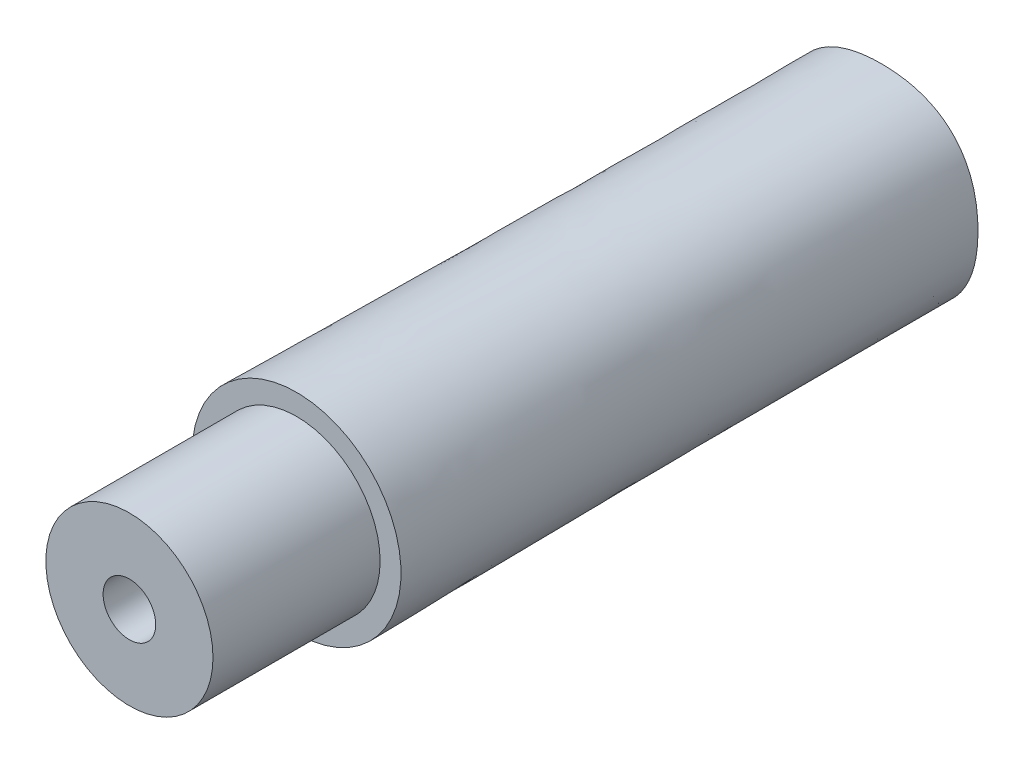
ISO-10303-21;
HEADER;
FILE_DESCRIPTION(('STEP AP214'),'2;1');
FILE_NAME('part.step','',(''),(''),'','','');
FILE_SCHEMA(('AUTOMOTIVE_DESIGN { 1 0 10303 214 1 1 1 1 }'));
ENDSEC;
DATA;
#1=APPLICATION_CONTEXT('core data for automotive mechanical design processes');
#2=APPLICATION_PROTOCOL_DEFINITION('international standard','automotive_design',2000,#1);
#3=PRODUCT_CONTEXT('',#1,'mechanical');
#4=PRODUCT('Part','Part','',(#3));
#5=PRODUCT_RELATED_PRODUCT_CATEGORY('part','',(#4));
#6=PRODUCT_DEFINITION_FORMATION('','',#4);
#7=PRODUCT_DEFINITION_CONTEXT('part definition',#1,'design');
#8=PRODUCT_DEFINITION('design','',#6,#7);
#9=PRODUCT_DEFINITION_SHAPE('','',#8);
#10=(LENGTH_UNIT() NAMED_UNIT(*) SI_UNIT(.MILLI.,.METRE.));
#11=(NAMED_UNIT(*) PLANE_ANGLE_UNIT() SI_UNIT($,.RADIAN.));
#12=(NAMED_UNIT(*) SI_UNIT($,.STERADIAN.) SOLID_ANGLE_UNIT());
#13=UNCERTAINTY_MEASURE_WITH_UNIT(LENGTH_MEASURE(1.E-05),#10,'distance_accuracy_value','');
#14=(GEOMETRIC_REPRESENTATION_CONTEXT(3) GLOBAL_UNCERTAINTY_ASSIGNED_CONTEXT((#13)) GLOBAL_UNIT_ASSIGNED_CONTEXT((#10,
#11,#12)) REPRESENTATION_CONTEXT('',''));
#15=CARTESIAN_POINT('',(0.,0.,0.));
#16=DIRECTION('',(0.,0.,1.));
#17=DIRECTION('',(1.,0.,0.));
#18=AXIS2_PLACEMENT_3D('',#15,#16,#17);
#19=CARTESIAN_POINT('',(-15.,0.,0.));
#20=CARTESIAN_POINT('',(-11.4703442530879,0.,73.4161185565387));
#21=CARTESIAN_POINT('',(-10.63958843352,0.,146.522630678536));
#22=CARTESIAN_POINT('',(-12.5,0.,220.));
#23=CARTESIAN_POINT('',(-15.,-1.96349539571791,0.));
#24=CARTESIAN_POINT('',(-11.4703442530879,-1.85441231817803,73.4161185565387));
#25=CARTESIAN_POINT('',(-10.63958843352,-1.74532924063814,146.522630678536));
#26=CARTESIAN_POINT('',(-12.5,-1.63624616309826,220.));
#27=CARTESIAN_POINT('',(-14.2198461388777,-5.88984756492641,0.));
#28=CARTESIAN_POINT('',(-11.0705725748364,-5.22559350962199,73.4161185565386));
#29=CARTESIAN_POINT('',(-10.2828364472213,-4.89870194523564,146.522630678536));
#30=CARTESIAN_POINT('',(-11.8498717823981,-4.90820630410533,220.));
#31=CARTESIAN_POINT('',(-10.882974650403,-10.8829746504029,0.));
#32=CARTESIAN_POINT('',(-8.93020374081342,-8.93020374081315,73.4161185565387));
#33=CARTESIAN_POINT('',(-8.32688279489595,-8.3268827948957,146.522630678537));
#34=CARTESIAN_POINT('',(-9.06914554200247,-9.06914554200244,220.000000000001));
#35=CARTESIAN_POINT('',(-5.88984756492637,-14.2198461388777,0.));
#36=CARTESIAN_POINT('',(-5.225593509622,-11.0705725748361,73.4161185565382));
#37=CARTESIAN_POINT('',(-4.89870194523566,-10.2828364472209,146.522630678536));
#38=CARTESIAN_POINT('',(-4.90820630410531,-11.8498717823981,220.));
#39=CARTESIAN_POINT('',(-1.96349539571792,-15.,0.));
#40=CARTESIAN_POINT('',(-1.85441231817803,-11.4703442530875,73.4161185565383));
#41=CARTESIAN_POINT('',(-1.74532924063814,-10.6395884335195,146.522630678536));
#42=CARTESIAN_POINT('',(-1.63624616309826,-12.5,220.));
#43=CARTESIAN_POINT('',(1.96349539571791,-15.,0.));
#44=CARTESIAN_POINT('',(1.85441231817803,-11.4703442530875,73.4161185565383));
#45=CARTESIAN_POINT('',(1.74532924063814,-10.6395884335195,146.522630678536));
#46=CARTESIAN_POINT('',(1.63624616309826,-12.5,220.));
#47=CARTESIAN_POINT('',(5.88984756492637,-14.2198461388777,0.));
#48=CARTESIAN_POINT('',(5.22559350962201,-11.0705725748361,73.4161185565382));
#49=CARTESIAN_POINT('',(4.89870194523567,-10.2828364472209,146.522630678536));
#50=CARTESIAN_POINT('',(4.90820630410531,-11.8498717823981,220.));
#51=CARTESIAN_POINT('',(10.8829746504029,-10.8829746504029,0.));
#52=CARTESIAN_POINT('',(8.9302037408134,-8.93020374081318,73.4161185565382));
#53=CARTESIAN_POINT('',(8.32688279489594,-8.32688279489572,146.522630678536));
#54=CARTESIAN_POINT('',(9.06914554200246,-9.06914554200246,220.));
#55=CARTESIAN_POINT('',(14.2198461388777,-5.8898475649264,0.));
#56=CARTESIAN_POINT('',(11.0705725748364,-5.22559350962197,73.4161185565379));
#57=CARTESIAN_POINT('',(10.2828364472213,-4.89870194523562,146.522630678536));
#58=CARTESIAN_POINT('',(11.8498717823981,-4.90820630410532,220.));
#59=CARTESIAN_POINT('',(15.,-1.96349539571791,0.));
#60=CARTESIAN_POINT('',(11.4703442530879,-1.85441231817803,73.4161185565379));
#61=CARTESIAN_POINT('',(10.63958843352,-1.74532924063814,146.522630678536));
#62=CARTESIAN_POINT('',(12.5,-1.63624616309826,220.));
#63=CARTESIAN_POINT('',(15.,1.96349539571791,0.));
#64=CARTESIAN_POINT('',(11.4703442530879,1.85441231817803,73.4161185565379));
#65=CARTESIAN_POINT('',(10.63958843352,1.74532924063814,146.522630678536));
#66=CARTESIAN_POINT('',(12.5,1.63624616309826,220.));
#67=CARTESIAN_POINT('',(14.2198461388777,5.8898475649264,0.));
#68=CARTESIAN_POINT('',(11.0705725748364,5.22559350962203,73.4161185565376));
#69=CARTESIAN_POINT('',(10.2828364472213,4.89870194523567,146.522630678535));
#70=CARTESIAN_POINT('',(11.8498717823981,4.90820630410532,219.999999999999));
#71=CARTESIAN_POINT('',(10.8829746504029,10.8829746504029,0.));
#72=CARTESIAN_POINT('',(8.9302037408134,8.93020374081338,73.4161185565383));
#73=CARTESIAN_POINT('',(8.32688279489595,8.32688279489593,146.522630678537));
#74=CARTESIAN_POINT('',(9.06914554200247,9.06914554200246,220.000000000001));
#75=CARTESIAN_POINT('',(5.88984756492638,14.2198461388777,0.));
#76=CARTESIAN_POINT('',(5.22559350962201,11.0705725748364,73.4161185565376));
#77=CARTESIAN_POINT('',(4.89870194523566,10.2828364472213,146.522630678535));
#78=CARTESIAN_POINT('',(4.90820630410531,11.8498717823981,219.999999999999));
#79=CARTESIAN_POINT('',(1.96349539571791,15.,0.));
#80=CARTESIAN_POINT('',(1.85441231817802,11.4703442530879,73.4161185565379));
#81=CARTESIAN_POINT('',(1.74532924063814,10.63958843352,146.522630678536));
#82=CARTESIAN_POINT('',(1.63624616309826,12.5,220.));
#83=CARTESIAN_POINT('',(-1.96349539571791,15.,0.));
#84=CARTESIAN_POINT('',(-1.85441231817803,11.4703442530879,73.4161185565379));
#85=CARTESIAN_POINT('',(-1.74532924063815,10.63958843352,146.522630678536));
#86=CARTESIAN_POINT('',(-1.63624616309826,12.5,220.));
#87=CARTESIAN_POINT('',(-5.88984756492638,14.2198461388777,0.));
#88=CARTESIAN_POINT('',(-5.22559350962202,11.0705725748364,73.4161185565378));
#89=CARTESIAN_POINT('',(-4.89870194523568,10.2828364472213,146.522630678536));
#90=CARTESIAN_POINT('',(-4.90820630410532,11.8498717823981,219.999999999999));
#91=CARTESIAN_POINT('',(-10.882974650403,10.882974650403,0.));
#92=CARTESIAN_POINT('',(-8.93020374081341,8.93020374081341,73.4161185565386));
#93=CARTESIAN_POINT('',(-8.32688279489594,8.32688279489595,146.522630678537));
#94=CARTESIAN_POINT('',(-9.06914554200245,9.06914554200247,220.000000000001));
#95=CARTESIAN_POINT('',(-14.2198461388777,5.88984756492638,0.));
#96=CARTESIAN_POINT('',(-11.0705725748364,5.22559350962201,73.4161185565384));
#97=CARTESIAN_POINT('',(-10.2828364472213,4.89870194523566,146.522630678536));
#98=CARTESIAN_POINT('',(-11.8498717823981,4.90820630410531,219.999999999999));
#99=CARTESIAN_POINT('',(-15.,1.96349539571791,0.));
#100=CARTESIAN_POINT('',(-11.4703442530879,1.85441231817803,73.4161185565387));
#101=CARTESIAN_POINT('',(-10.63958843352,1.74532924063814,146.522630678536));
#102=CARTESIAN_POINT('',(-12.5,1.63624616309826,220.));
#103=CARTESIAN_POINT('',(-15.,0.,0.));
#104=CARTESIAN_POINT('',(-11.4703442530879,0.,73.4161185565387));
#105=CARTESIAN_POINT('',(-10.63958843352,0.,146.522630678536));
#106=CARTESIAN_POINT('',(-12.5,0.,220.));
#107=B_SPLINE_SURFACE_WITH_KNOTS('',3,3,((#19,#20,#21,#22),(#23,#24,#25,#26),(#27,#28,#29,#30),
(#31,#32,#33,#34),(#35,#36,#37,#38),(#39,#40,#41,#42),(#43,#44,#45,#46),(#47,#48,#49,#50),(#51,
#52,#53,#54),(#55,#56,#57,#58),(#59,#60,#61,#62),(#63,#64,#65,#66),(#67,#68,#69,#70),(#71,#72,
#73,#74),(#75,#76,#77,#78),(#79,#80,#81,#82),(#83,#84,#85,#86),(#87,#88,#89,#90),(#91,#92,#93,
#94),(#95,#96,#97,#98),(#99,#100,#101,#102),(#103,#104,#105,#106)),.UNSPECIFIED.,.T.,.F.,.F.,(4,
1,1,1,2,1,1,1,2,1,1,1,2,1,1,1,4),(4,4),(0.,0.0625,0.125,0.1875,0.25,0.3125,0.375,0.4375,0.5,
0.5625,0.625,0.6875,0.75,0.8125,0.875,0.9375,1.),(0.,1.),.UNSPECIFIED.);
#108=CARTESIAN_POINT('',(0.,0.,220.));
#109=DIRECTION('',(0.,0.,1.));
#110=DIRECTION('',(1.,0.,0.));
#111=AXIS2_PLACEMENT_3D('',#108,#109,#110);
#112=CIRCLE('',#111,12.5);
#113=CARTESIAN_POINT('',(-12.5,0.,220.));
#114=VERTEX_POINT('',#113);
#115=EDGE_CURVE('E133',#114,#114,#112,.T.);
#116=CARTESIAN_POINT('',(-11.541854565399,0.,149.999999997366));
#117=CARTESIAN_POINT('',(-11.5418536994029,-0.401355757927279,149.999999997418));
#118=CARTESIAN_POINT('',(-11.5293171598583,-0.802707549844226,149.999999999308));
#119=CARTESIAN_POINT('',(-11.4759797494714,-1.60374827617522,150.000000000692));
#120=CARTESIAN_POINT('',(-11.4351710584041,-2.00343671971828,150.000000000185));
#121=CARTESIAN_POINT('',(-11.3216394636897,-2.79775464109179,149.999999999815));
#122=CARTESIAN_POINT('',(-11.2489631262335,-3.19239063899266,149.999999999951));
#123=CARTESIAN_POINT('',(-11.0675723921283,-3.97326288959729,150.000000000049));
#124=CARTESIAN_POINT('',(-10.9588815423036,-4.3595044553448,150.000000000011));
#125=CARTESIAN_POINT('',(-10.7427202803528,-4.9960152801339,149.999999999993));
#126=CARTESIAN_POINT('',(-10.6461388384174,-5.25000013290062,149.999999999998));
#127=CARTESIAN_POINT('',(-10.4337811359734,-5.74984283685569,150.000000000002));
#128=CARTESIAN_POINT('',(-10.3180063908867,-5.99570132783038,150.000000000001));
#129=CARTESIAN_POINT('',(-10.0670053989865,-6.47705937535507,149.999999999999));
#130=CARTESIAN_POINT('',(-9.93179509497459,-6.7125672176856,150.));
#131=CARTESIAN_POINT('',(-9.64184809256927,-7.17122321615265,150.));
#132=CARTESIAN_POINT('',(-9.48711373000722,-7.39437284622081,150.));
#133=CARTESIAN_POINT('',(-9.15750136454443,-7.82742626969343,150.));
#134=CARTESIAN_POINT('',(-8.98251048976429,-8.03724465529183,150.));
#135=CARTESIAN_POINT('',(-8.70624921174298,-8.33924259631013,150.));
#136=CARTESIAN_POINT('',(-8.61186139999785,-8.43779142263712,150.));
#137=CARTESIAN_POINT('',(-8.41861810790369,-8.63045563928594,150.));
#138=CARTESIAN_POINT('',(-8.31976153520119,-8.72456993401321,150.));
#139=CARTESIAN_POINT('',(-8.01694953836434,-8.99991540051646,150.));
#140=CARTESIAN_POINT('',(-7.80665548691768,-9.17425435822067,150.));
#141=CARTESIAN_POINT('',(-7.37135617607085,-9.50359091828676,150.));
#142=CARTESIAN_POINT('',(-7.14634422384303,-9.65857962680361,150.));
#143=CARTESIAN_POINT('',(-6.69943566151898,-9.93904040360528,150.));
#144=CARTESIAN_POINT('',(-6.47834083793555,-10.0657944834204,150.));
#145=CARTESIAN_POINT('',(-6.02714425227574,-10.3021158197794,150.));
#146=CARTESIAN_POINT('',(-5.79704152776197,-10.4116812335259,150.));
#147=CARTESIAN_POINT('',(-5.32949709872402,-10.6139244558501,150.));
#148=CARTESIAN_POINT('',(-5.09205384947439,-10.706598681194,150.));
#149=CARTESIAN_POINT('',(-4.61139683146734,-10.8755182315322,150.));
#150=CARTESIAN_POINT('',(-4.36818243831409,-10.9517617697655,150.));
#151=CARTESIAN_POINT('',(-3.85608072140049,-11.0948547700045,150.));
#152=CARTESIAN_POINT('',(-3.58680439864019,-11.1603048950958,150.));
#153=CARTESIAN_POINT('',(-3.04460955998237,-11.2744817469932,150.));
#154=CARTESIAN_POINT('',(-2.7716890747401,-11.3231990169402,150.));
#155=CARTESIAN_POINT('',(-2.22348281409539,-11.4052379600946,150.));
#156=CARTESIAN_POINT('',(-1.94819632371092,-11.438554799978,150.));
#157=CARTESIAN_POINT('',(-1.39522105679997,-11.4911397562973,150.));
#158=CARTESIAN_POINT('',(-1.11752709620361,-11.5103524478534,150.));
#159=CARTESIAN_POINT('',(-0.561639275551755,-11.5356687296765,150.));
#160=CARTESIAN_POINT('',(-0.283445582040061,-11.5417760846317,150.));
#161=CARTESIAN_POINT('',(0.27291832299971,-11.5419316056286,150.));
#162=CARTESIAN_POINT('',(0.551088535015663,-11.5359802173951,150.));
#163=CARTESIAN_POINT('',(1.19691351920611,-11.5069535016099,150.));
#164=CARTESIAN_POINT('',(1.5643781536077,-11.4789574123874,150.));
#165=CARTESIAN_POINT('',(2.11335862067173,-11.4177369408435,150.));
#166=CARTESIAN_POINT('',(2.29597764410096,-11.3941266519661,150.));
#167=CARTESIAN_POINT('',(2.66026578396025,-11.3401093531148,150.));
#168=CARTESIAN_POINT('',(2.84193454474969,-11.3096999621338,150.));
#169=CARTESIAN_POINT('',(3.38325932982941,-11.2079976696009,150.));
#170=CARTESIAN_POINT('',(3.74103471936672,-11.126038003588,150.));
#171=CARTESIAN_POINT('',(4.27101276853864,-10.9793388933274,150.));
#172=CARTESIAN_POINT('',(4.44656941455521,-10.9264749427759,150.));
#173=CARTESIAN_POINT('',(4.79494128732353,-10.8123963566293,150.));
#174=CARTESIAN_POINT('',(4.96775680415604,-10.7511826113244,150.));
#175=CARTESIAN_POINT('',(5.38993427533975,-10.5895650277931,150.));
#176=CARTESIAN_POINT('',(5.6374193009443,-10.4841956906733,150.));
#177=CARTESIAN_POINT('',(6.12341250542991,-10.2544514992782,150.));
#178=CARTESIAN_POINT('',(6.36192097243637,-10.1300772556629,150.));
#179=CARTESIAN_POINT('',(6.82800416506739,-9.86205990721202,150.));
#180=CARTESIAN_POINT('',(7.05557508095503,-9.71841015350808,150.));
#181=CARTESIAN_POINT('',(7.4974461259936,-9.4121108784702,150.));
#182=CARTESIAN_POINT('',(7.71175147278949,-9.24946890079687,150.));
#183=CARTESIAN_POINT('',(8.12599163537684,-8.90497731547193,150.));
#184=CARTESIAN_POINT('',(8.3258575398975,-8.72304467129187,150.));
#185=CARTESIAN_POINT('',(8.70814352515308,-8.34169043576707,150.));
#186=CARTESIAN_POINT('',(8.8905635988201,-8.14226883733702,150.));
#187=CARTESIAN_POINT('',(9.23674385474077,-7.72802588603659,150.));
#188=CARTESIAN_POINT('',(9.40051264724978,-7.51321171428797,150.));
#189=CARTESIAN_POINT('',(9.70893085192531,-7.07015279729179,150.));
#190=CARTESIAN_POINT('',(9.85357159024528,-6.84190202639231,150.));
#191=CARTESIAN_POINT('',(10.1164781421454,-6.38634269968815,150.));
#192=CARTESIAN_POINT('',(10.2357208863338,-6.15959543283219,150.));
#193=CARTESIAN_POINT('',(10.4569568876952,-5.69783055025263,150.));
#194=CARTESIAN_POINT('',(10.5589483802222,-5.46281209142829,150.));
#195=CARTESIAN_POINT('',(10.746093058012,-4.98598753217331,150.));
#196=CARTESIAN_POINT('',(10.8312335848246,-4.74417648368212,150.));
#197=CARTESIAN_POINT('',(10.9853598858867,-4.25547375680911,150.));
#198=CARTESIAN_POINT('',(11.0543442917362,-4.00858164999423,150.));
#199=CARTESIAN_POINT('',(11.1855243746252,-3.47793919286741,150.));
#200=CARTESIAN_POINT('',(11.2455882293671,-3.19366391267622,150.));
#201=CARTESIAN_POINT('',(11.3480841507545,-2.62182048256758,150.));
#202=CARTESIAN_POINT('',(11.3905054022288,-2.3342504235514,150.));
#203=CARTESIAN_POINT('',(11.4592057307189,-1.75706364773313,150.));
#204=CARTESIAN_POINT('',(11.4854770915521,-1.46744601937061,150.));
#205=CARTESIAN_POINT('',(11.5138155244204,-1.03189790564804,150.));
#206=CARTESIAN_POINT('',(11.5214200732818,-0.886300436970029,150.));
#207=CARTESIAN_POINT('',(11.533061955762,-0.594958534543804,150.));
#208=CARTESIAN_POINT('',(11.5370992532269,-0.449214099321083,150.));
#209=CARTESIAN_POINT('',(11.5417747295487,-0.157730273853745,150.));
#210=CARTESIAN_POINT('',(11.5424142602128,-0.0119909046745823,150.));
#211=CARTESIAN_POINT('',(11.5403610855083,0.279460748718199,150.));
#212=CARTESIAN_POINT('',(11.5376684101048,0.425173033163593,150.));
#213=CARTESIAN_POINT('',(11.5243364586219,0.862094505077408,150.));
#214=CARTESIAN_POINT('',(11.5084445767624,1.15316341010471,150.));
#215=CARTESIAN_POINT('',(11.4571778167239,1.78609261947361,150.));
#216=CARTESIAN_POINT('',(11.4188251726858,2.12772037606876,150.));
#217=CARTESIAN_POINT('',(11.3185176534011,2.80751977078997,150.));
#218=CARTESIAN_POINT('',(11.2565641974387,3.14569161548904,150.));
#219=CARTESIAN_POINT('',(11.1067334330443,3.81490275391266,150.));
#220=CARTESIAN_POINT('',(11.0189655890046,4.14596595631763,150.));
#221=CARTESIAN_POINT('',(10.8658383274791,4.63574459366194,150.));
#222=CARTESIAN_POINT('',(10.8112199494759,4.79786011791878,150.));
#223=CARTESIAN_POINT('',(10.6945243358615,5.11941766533972,150.));
#224=CARTESIAN_POINT('',(10.6324459631435,5.27885927669496,150.));
#225=CARTESIAN_POINT('',(10.4639957180397,5.68253189543206,150.));
#226=CARTESIAN_POINT('',(10.3522096413007,5.92453324930647,150.));
#227=CARTESIAN_POINT('',(10.1098492399233,6.39894785918335,150.));
#228=CARTESIAN_POINT('',(9.97927532680361,6.63136132505039,150.));
#229=CARTESIAN_POINT('',(9.69919397361224,7.08469894019758,150.));
#230=CARTESIAN_POINT('',(9.54967556483482,7.30561632796521,150.));
#231=CARTESIAN_POINT('',(9.23212465099859,7.73363753372576,150.));
#232=CARTESIAN_POINT('',(9.06410076682816,7.94074771230781,150.));
#233=CARTESIAN_POINT('',(8.79848324532445,8.23989583016644,150.));
#234=CARTESIAN_POINT('',(8.70749661383106,8.33786554693269,150.));
#235=CARTESIAN_POINT('',(8.52119653991513,8.52959727617441,150.));
#236=CARTESIAN_POINT('',(8.42588318165068,8.62335937042083,150.));
#237=CARTESIAN_POINT('',(8.13375639123133,8.89806006473028,150.));
#238=CARTESIAN_POINT('',(7.9307188639717,9.07245516430253,150.));
#239=CARTESIAN_POINT('',(7.51031133305755,9.40264067152794,150.));
#240=CARTESIAN_POINT('',(7.292949803326,9.55844192842484,150.));
#241=CARTESIAN_POINT('',(6.84576339722231,9.85119968558504,150.));
#242=CARTESIAN_POINT('',(6.61593299105821,9.9881477278517,150.));
#243=CARTESIAN_POINT('',(6.15446671413528,10.2384694135765,150.));
#244=CARTESIAN_POINT('',(5.92319300005266,10.3525137270258,150.));
#245=CARTESIAN_POINT('',(5.45286012144287,10.563241642327,150.));
#246=CARTESIAN_POINT('',(5.21380012245186,10.6599233761337,150.));
#247=CARTESIAN_POINT('',(4.72925488053419,10.8364474130886,150.));
#248=CARTESIAN_POINT('',(4.48376246498554,10.9162699331389,150.));
#249=CARTESIAN_POINT('',(3.98817276363169,11.0599596309804,150.));
#250=CARTESIAN_POINT('',(3.73807517312787,11.1238257489234,150.));
#251=CARTESIAN_POINT('',(3.19309934271747,11.2460741856969,150.));
#252=CARTESIAN_POINT('',(2.89763140502402,11.3018198231188,150.));
#253=CARTESIAN_POINT('',(2.30368190943547,11.3950220202179,150.));
#254=CARTESIAN_POINT('',(2.00519853205604,11.4324667698637,150.));
#255=CARTESIAN_POINT('',(1.40644486124677,11.4906692941387,150.));
#256=CARTESIAN_POINT('',(1.10617360920646,11.5114171143019,150.));
#257=CARTESIAN_POINT('',(0.654957775512834,11.5310954925752,150.));
#258=CARTESIAN_POINT('',(0.504235538160645,11.5357464027898,150.));
#259=CARTESIAN_POINT('',(0.202721931225564,11.5413919372327,150.));
#260=CARTESIAN_POINT('',(0.0519305609101198,11.542386521778,150.));
#261=CARTESIAN_POINT('',(-0.400265113032265,11.5400270336634,150.));
#262=CARTESIAN_POINT('',(-0.701664376340691,11.5313370056312,150.));
#263=CARTESIAN_POINT('',(-1.30352120640034,11.4983198168705,150.));
#264=CARTESIAN_POINT('',(-1.6039790396715,11.4739975783707,150.));
#265=CARTESIAN_POINT('',(-2.22952224973743,11.405325473926,150.));
#266=CARTESIAN_POINT('',(-2.5544389746431,11.3593964592959,150.));
#267=CARTESIAN_POINT('',(-3.2003394714485,11.2450875624389,150.));
#268=CARTESIAN_POINT('',(-3.52132344195218,11.1767088188102,150.));
#269=CARTESIAN_POINT('',(-4.15584527363419,11.0154934741266,150.));
#270=CARTESIAN_POINT('',(-4.46940712680948,10.9227524629793,150.));
#271=CARTESIAN_POINT('',(-5.08731021384819,10.7103625054095,150.));
#272=CARTESIAN_POINT('',(-5.39165354277786,10.5907197257317,150.));
#273=CARTESIAN_POINT('',(-5.93082254939972,10.3490505408438,150.));
#274=CARTESIAN_POINT('',(-6.16781686510172,10.2318507637158,150.));
#275=CARTESIAN_POINT('',(-6.6317239090533,9.97890651786635,150.));
#276=CARTESIAN_POINT('',(-6.85863727011576,9.84316321536554,150.));
#277=CARTESIAN_POINT('',(-7.30039432872054,9.55315824389443,150.));
#278=CARTESIAN_POINT('',(-7.51523524618186,9.39889233492606,150.));
#279=CARTESIAN_POINT('',(-7.93077346940004,9.07229199407985,150.));
#280=CARTESIAN_POINT('',(-8.13147158321449,8.89995859590081,150.));
#281=CARTESIAN_POINT('',(-8.42059370564552,8.6284543387516,150.));
#282=CARTESIAN_POINT('',(-8.51508322550793,8.53566998385946,150.));
#283=CARTESIAN_POINT('',(-8.69981989992102,8.34596960586576,150.));
#284=CARTESIAN_POINT('',(-8.79006704406861,8.24905357263366,150.));
#285=CARTESIAN_POINT('',(-9.05423047488045,7.95245722105068,150.));
#286=CARTESIAN_POINT('',(-9.22160948494089,7.74689034948627,150.));
#287=CARTESIAN_POINT('',(-9.53810831145911,7.32206689758776,150.));
#288=CARTESIAN_POINT('',(-9.6872194802265,7.10280390732519,150.));
#289=CARTESIAN_POINT('',(-9.96680435941036,6.65271636976094,150.));
#290=CARTESIAN_POINT('',(-10.0972763746923,6.42189077347518,150.));
#291=CARTESIAN_POINT('',(-10.3653895098786,5.90057358318735,150.));
#292=CARTESIAN_POINT('',(-10.4986646064036,5.60782445674551,149.999999999999));
#293=CARTESIAN_POINT('',(-10.67854786503,5.16076657034955,150.));
#294=CARTESIAN_POINT('',(-10.7351815328833,5.01038910252547,150.000000000001));
#295=CARTESIAN_POINT('',(-10.8419151693467,4.70733072067654,149.999999999999));
#296=CARTESIAN_POINT('',(-10.8920151978562,4.55464982778344,149.999999999997));
#297=CARTESIAN_POINT('',(-11.0329216672749,4.09364819502358,150.000000000006));
#298=CARTESIAN_POINT('',(-11.114315705692,3.78241578160942,150.000000000033));
#299=CARTESIAN_POINT('',(-11.2541610859927,3.15499065004393,149.999999999967));
#300=CARTESIAN_POINT('',(-11.312614514823,2.83879838582165,149.999999999873));
#301=CARTESIAN_POINT('',(-11.4237408543973,2.10429186971091,150.000000000167));
#302=CARTESIAN_POINT('',(-11.4689423855298,1.68484494882285,150.000000000713));
#303=CARTESIAN_POINT('',(-11.5280113046448,0.843598233010171,149.999999999286));
#304=CARTESIAN_POINT('',(-11.5418554755005,0.421796926366122,149.999999997311));
#305=CARTESIAN_POINT('',(-11.541854565399,0.,149.999999997366));
#306=B_SPLINE_CURVE_WITH_KNOTS('',3,(#116,#117,#118,#119,#120,#121,#122,#123,#124,#125,#126,
#127,#128,#129,#130,#131,#132,#133,#134,#135,#136,#137,#138,#139,#140,#141,#142,#143,#144,#145,
#146,#147,#148,#149,#150,#151,#152,#153,#154,#155,#156,#157,#158,#159,#160,#161,#162,#163,#164,
#165,#166,#167,#168,#169,#170,#171,#172,#173,#174,#175,#176,#177,#178,#179,#180,#181,#182,#183,
#184,#185,#186,#187,#188,#189,#190,#191,#192,#193,#194,#195,#196,#197,#198,#199,#200,#201,#202,
#203,#204,#205,#206,#207,#208,#209,#210,#211,#212,#213,#214,#215,#216,#217,#218,#219,#220,#221,
#222,#223,#224,#225,#226,#227,#228,#229,#230,#231,#232,#233,#234,#235,#236,#237,#238,#239,#240,
#241,#242,#243,#244,#245,#246,#247,#248,#249,#250,#251,#252,#253,#254,#255,#256,#257,#258,#259,
#260,#261,#262,#263,#264,#265,#266,#267,#268,#269,#270,#271,#272,#273,#274,#275,#276,#277,#278,
#279,#280,#281,#282,#283,#284,#285,#286,#287,#288,#289,#290,#291,#292,#293,#294,#295,#296,#297,
#298,#299,#300,#301,#302,#303,#304,#305),.UNSPECIFIED.,.T.,.F.,(4,2,2,2,2,2,2,2,2,2,2,2,2,2,2,2,
2,2,2,2,2,2,2,2,2,2,2,2,2,2,2,2,2,2,2,2,2,2,2,2,2,2,2,2,2,2,2,2,2,2,2,2,2,2,2,2,2,2,2,2,2,2,2,2,
2,2,2,2,2,2,2,2,2,2,2,2,2,2,2,2,2,2,2,2,2,2,2,2,2,2,2,2,2,2,4),(0.,1.20381099343524,
2.40795510031138,3.61034550027078,4.81195130561032,5.62642260415793,6.44082962611149,
7.25457237030319,8.06821785158514,8.88663767278015,9.2958871169127,9.7052371456012,
10.5235108736601,11.3421593263665,12.1059451391833,12.8698127816196,13.6338422799682,
14.3979548210967,15.228712448359,16.059938822884,16.8914258955337,17.7261632121628,
18.5606607068906,19.3951273568223,20.4997950619257,21.0520981738135,21.6045950029089,
22.7041684860749,23.2540284701402,23.8038298715833,24.6099664416323,25.4160771145809,
26.2224665644866,27.0285368012013,27.8382296157903,28.647922758412,29.4572405826277,
30.2669241524701,31.0347502169185,31.8026547755451,32.5711340129449,33.3396783159075,
34.210703401875,35.0822616545886,35.9542360021541,36.3915886998675,36.8289458300709,
37.2661289439571,37.7033081264752,38.5774413895769,39.6080129048051,40.6385224542396,
41.6647236859851,42.1777726219426,42.6908998599922,43.4897878110454,44.2886582663452,
45.0879933929453,45.8869577070263,46.2879498242811,46.6889341452762,47.4907345400058,
48.2920647842242,49.0937533606652,49.866611750852,50.6395532433556,51.4133967500854,
52.1872916430052,53.0886780003512,53.9906452798654,54.8931499015804,55.3454938236671,
55.7978426551325,56.7020201744825,57.6059131282147,58.5896397671476,59.5733165214457,
60.553189836354,61.5328387615768,62.3252389590696,63.1175893446501,63.9101214536883,
64.7026082441511,65.0997770986687,65.496946927068,66.2911194671754,67.0856665144091,
67.8802857756445,68.8437259308735,69.3256696663409,69.8076089831153,70.771639758794,
71.7355828145891,72.9997685577907,74.264890004108),.UNSPECIFIED.);
#307=CARTESIAN_POINT('',(-11.5418545654096,0.,150.));
#308=VERTEX_POINT('',#307);
#309=EDGE_CURVE('E137',#308,#308,#306,.T.);
#310=CARTESIAN_POINT('',(-12.5,0.,220.));
#311=CARTESIAN_POINT('',(-12.4907572499981,0.,219.634955531518));
#312=CARTESIAN_POINT('',(-12.481580649936,0.,219.269909388141));
#313=CARTESIAN_POINT('',(-12.463360315348,0.,218.539835242541));
#314=CARTESIAN_POINT('',(-12.4543165730491,0.,218.174807240513));
#315=CARTESIAN_POINT('',(-12.4363619558713,0.,217.444769210711));
#316=CARTESIAN_POINT('',(-12.4274510732959,0.,217.079759183127));
#317=CARTESIAN_POINT('',(-12.4097621773682,0.,216.349756935323));
#318=CARTESIAN_POINT('',(-12.4009841563958,0.,215.984764715288));
#319=CARTESIAN_POINT('',(-12.3835609854987,0.,215.254797915688));
#320=CARTESIAN_POINT('',(-12.3749158280305,0.,214.889823336303));
#321=CARTESIAN_POINT('',(-12.3577583859605,0.,214.159891651111));
#322=CARTESIAN_POINT('',(-12.3492460938919,0.,213.794934545479));
#323=CARTESIAN_POINT('',(-12.3323543844413,0.,213.065037640901));
#324=CARTESIAN_POINT('',(-12.3239749596691,0.,212.700097842125));
#325=CARTESIAN_POINT('',(-12.3073489866312,0.,211.970235384364));
#326=CARTESIAN_POINT('',(-12.2991024310521,0.,211.605312725547));
#327=CARTESIAN_POINT('',(-12.28274219822,0.,210.87548438081));
#328=CARTESIAN_POINT('',(-12.2746285137304,0.,210.510578695053));
#329=CARTESIAN_POINT('',(-12.2585340248973,0.,209.780784129544));
#330=CARTESIAN_POINT('',(-12.2505532133939,0.,209.415895249951));
#331=CARTESIAN_POINT('',(-12.2347244723529,0.,208.686134129875));
#332=CARTESIAN_POINT('',(-12.2268765357323,0.,208.321261889547));
#333=CARTESIAN_POINT('',(-12.2113135462764,0.,207.59153388111));
#334=CARTESIAN_POINT('',(-12.2035984864352,0.,207.22667811315));
#335=CARTESIAN_POINT('',(-12.1883012523577,0.,206.496982882556));
#336=CARTESIAN_POINT('',(-12.1807190711924,0.,206.132143420068));
#337=CARTESIAN_POINT('',(-12.1656875962864,0.,205.402480633522));
#338=CARTESIAN_POINT('',(-12.1582382956937,0.,205.037657309606));
#339=CARTESIAN_POINT('',(-12.1434725837523,0.,204.308026633313));
#340=CARTESIAN_POINT('',(-12.1361561656286,0.,203.943219281073));
#341=CARTESIAN_POINT('',(-12.121656220445,0.,203.213620381239));
#342=CARTESIAN_POINT('',(-12.1144726866871,0.,202.848828833777));
#343=CARTESIAN_POINT('',(-12.1002385120544,0.,202.119261376605));
#344=CARTESIAN_POINT('',(-12.0931878645587,0.,201.754485467025));
#345=CARTESIAN_POINT('',(-12.07921946427,0.,201.024949118721));
#346=CARTESIAN_POINT('',(-12.0723017049333,0.,200.660188680124));
#347=CARTESIAN_POINT('',(-12.0585990827817,0.,199.930683106893));
#348=CARTESIAN_POINT('',(-12.0518142135004,0.,199.565937972381));
#349=CARTESIAN_POINT('',(-12.0383773732792,0.,198.836462840428));
#350=CARTESIAN_POINT('',(-12.0317253959499,0.,198.471732843105));
#351=CARTESIAN_POINT('',(-12.0185543414521,0.,197.742287818635));
#352=CARTESIAN_POINT('',(-12.0120352579715,0.,197.377572791603));
#353=CARTESIAN_POINT('',(-11.9991299929902,0.,196.64815754082));
#354=CARTESIAN_POINT('',(-11.9927438052548,0.,196.283457317181));
#355=CARTESIAN_POINT('',(-11.9801043335833,0.,195.554071506292));
#356=CARTESIAN_POINT('',(-11.9738510434897,0.,195.189385919149));
#357=CARTESIAN_POINT('',(-11.961477368921,0.,194.460029214357));
#358=CARTESIAN_POINT('',(-11.9553569783658,0.,194.095358096812));
#359=CARTESIAN_POINT('',(-11.943249104693,0.,193.366030164323));
#360=CARTESIAN_POINT('',(-11.9372616155728,0.,193.001373349479));
#361=CARTESIAN_POINT('',(-11.9254195465891,0.,192.272073855498));
#362=CARTESIAN_POINT('',(-11.9195649608004,0.,191.907431176457));
#363=CARTESIAN_POINT('',(-11.907988700299,0.,191.178159787189));
#364=CARTESIAN_POINT('',(-11.9022670197385,0.,190.813531077054));
#365=CARTESIAN_POINT('',(-11.8909565715124,0.,190.084287458703));
#366=CARTESIAN_POINT('',(-11.8853677980766,0.,189.719672550577));
#367=CARTESIAN_POINT('',(-11.874323165919,0.,188.990456369349));
#368=CARTESIAN_POINT('',(-11.8688673015045,0.,188.625855096333));
#369=CARTESIAN_POINT('',(-11.8580884892085,0.,187.896666018432));
#370=CARTESIAN_POINT('',(-11.8527655357119,0.,187.53207821363));
#371=CARTESIAN_POINT('',(-11.8422525470707,0.,186.802915905262));
#372=CARTESIAN_POINT('',(-11.8370625063886,0.,186.438341401776));
#373=CARTESIAN_POINT('',(-11.8268153451953,0.,185.709205529145));
#374=CARTESIAN_POINT('',(-11.8217582192242,0.,185.344644160077));
#375=CARTESIAN_POINT('',(-11.8117768892719,0.,184.615534389389));
#376=CARTESIAN_POINT('',(-11.8068526799085,0.,184.250985987842));
#377=CARTESIAN_POINT('',(-11.7971371849904,0.,183.521901985301));
#378=CARTESIAN_POINT('',(-11.7923458941312,0.,183.157366384378));
#379=CARTESIAN_POINT('',(-11.7828962380403,0.,182.428307816189));
#380=CARTESIAN_POINT('',(-11.7782378675819,0.,182.063784848992));
#381=CARTESIAN_POINT('',(-11.7690540541115,0.,181.334751381361));
#382=CARTESIAN_POINT('',(-11.7645286059505,0.,180.970240880992));
#383=CARTESIAN_POINT('',(-11.7556106388936,0.,180.241232180123));
#384=CARTESIAN_POINT('',(-11.7512181149266,0.,179.876733979685));
#385=CARTESIAN_POINT('',(-11.7425659980764,0.,179.147749711783));
#386=CARTESIAN_POINT('',(-11.7383064001999,0.,178.783263644379));
#387=CARTESIAN_POINT('',(-11.7299201373495,0.,178.054303475649));
#388=CARTESIAN_POINT('',(-11.7257934674601,0.,177.689829374381));
#389=CARTESIAN_POINT('',(-11.7176730624027,0.,176.960892971029));
#390=CARTESIAN_POINT('',(-11.7136793223971,0.,176.596430668999));
#391=CARTESIAN_POINT('',(-11.7058247789257,0.,175.867517697228));
#392=CARTESIAN_POINT('',(-11.7019639707003,0.,175.50306702754));
#393=CARTESIAN_POINT('',(-11.6943752926082,0.,174.774177153557));
#394=CARTESIAN_POINT('',(-11.6906474180597,0.,174.409737949311));
#395=CARTESIAN_POINT('',(-11.6833246091399,0.,173.68087083932));
#396=CARTESIAN_POINT('',(-11.6797296701648,0.,173.316442933621));
#397=CARTESIAN_POINT('',(-11.6726727342105,0.,172.587598253827));
#398=CARTESIAN_POINT('',(-11.6692107327055,0.,172.223181479776));
#399=CARTESIAN_POINT('',(-11.6624196735098,0.,171.494358896384));
#400=CARTESIAN_POINT('',(-11.6590906113713,0.,171.129953087084));
#401=CARTESIAN_POINT('',(-11.6525654327274,0.,170.401152266299));
#402=CARTESIAN_POINT('',(-11.6493693118521,0.,170.036757254853));
#403=CARTESIAN_POINT('',(-11.643110017553,0.,169.30797786288));
#404=CARTESIAN_POINT('',(-11.6400468398375,0.,168.94359348239));
#405=CARTESIAN_POINT('',(-11.6340534336764,0.,168.214835185434));
#406=CARTESIAN_POINT('',(-11.6311232010173,0.,167.850461269002));
#407=CARTESIAN_POINT('',(-11.6253956867873,0.,167.121723733268));
#408=CARTESIAN_POINT('',(-11.6225984010811,0.,166.757360113997));
#409=CARTESIAN_POINT('',(-11.6171367825753,0.,166.02864300569));
#410=CARTESIAN_POINT('',(-11.6144724457186,0.,165.664289516683));
#411=CARTESIAN_POINT('',(-11.6092767267303,0.,164.935592502007));
#412=CARTESIAN_POINT('',(-11.6067453406196,0.,164.571248976366));
#413=CARTESIAN_POINT('',(-11.6018155249418,0.,163.842571721527));
#414=CARTESIAN_POINT('',(-11.5994170914738,0.,163.478237992355));
#415=CARTESIAN_POINT('',(-11.5947531828996,0.,162.749580163558));
#416=CARTESIAN_POINT('',(-11.5924877039708,0.,162.385256063957));
#417=CARTESIAN_POINT('',(-11.5880897062935,0.,161.656617327406));
#418=CARTESIAN_POINT('',(-11.5859571838005,0.,161.292302690479));
#419=CARTESIAN_POINT('',(-11.581825100813,0.,160.56368271238));
#420=CARTESIAN_POINT('',(-11.5798255366524,0.,160.199377371229));
#421=CARTESIAN_POINT('',(-11.575959372148,0.,159.470775817787));
#422=CARTESIAN_POINT('',(-11.5740927682163,0.,159.106479605514));
#423=CARTESIAN_POINT('',(-11.5704925259881,0.,158.377896142933));
#424=CARTESIAN_POINT('',(-11.568758884182,0.,158.013608892642));
#425=CARTESIAN_POINT('',(-11.565424568023,0.,157.285043187128));
#426=CARTESIAN_POINT('',(-11.563823890239,0.,156.92076473192));
#427=CARTESIAN_POINT('',(-11.5607555039425,0.,156.192216449677));
#428=CARTESIAN_POINT('',(-11.5592877920772,0.,155.827946622656));
#429=CARTESIAN_POINT('',(-11.5564853394361,0.,155.099415429889));
#430=CARTESIAN_POINT('',(-11.5551505953858,0.,154.735154064157));
#431=CARTESIAN_POINT('',(-11.5526140801941,0.,154.006639627072));
#432=CARTESIAN_POINT('',(-11.5514123058566,0.,153.64238655573));
#433=CARTESIAN_POINT('',(-11.549141731904,0.,152.913888540532));
#434=CARTESIAN_POINT('',(-11.5480729291712,0.,152.549643596684));
#435=CARTESIAN_POINT('',(-11.5460683002638,0.,151.821161669577));
#436=CARTESIAN_POINT('',(-11.54513247105,0.,151.456924686325));
#437=CARTESIAN_POINT('',(-11.5433937909324,0.,150.728458513515));
#438=CARTESIAN_POINT('',(-11.5425909370679,0.,150.364229323964));
#439=CARTESIAN_POINT('',(-11.5418545654096,0.,150.));
#440=B_SPLINE_CURVE_WITH_KNOTS('',3,(#310,#311,#312,#313,#314,#315,#316,#317,#318,#319,#320,
#321,#322,#323,#324,#325,#326,#327,#328,#329,#330,#331,#332,#333,#334,#335,#336,#337,#338,#339,
#340,#341,#342,#343,#344,#345,#346,#347,#348,#349,#350,#351,#352,#353,#354,#355,#356,#357,#358,
#359,#360,#361,#362,#363,#364,#365,#366,#367,#368,#369,#370,#371,#372,#373,#374,#375,#376,#377,
#378,#379,#380,#381,#382,#383,#384,#385,#386,#387,#388,#389,#390,#391,#392,#393,#394,#395,#396,
#397,#398,#399,#400,#401,#402,#403,#404,#405,#406,#407,#408,#409,#410,#411,#412,#413,#414,#415,
#416,#417,#418,#419,#420,#421,#422,#423,#424,#425,#426,#427,#428,#429,#430,#431,#432,#433,#434,
#435,#436,#437,#438,#439),.UNSPECIFIED.,.F.,.F.,(4,2,2,2,2,2,2,2,2,2,2,2,2,2,2,2,2,2,2,2,2,2,2,
2,2,2,2,2,2,2,2,2,2,2,2,2,2,2,2,2,2,2,2,2,2,2,2,2,2,2,2,2,2,2,2,2,2,2,2,2,2,2,2,2,4),(0.,
1.09548437618729,2.19090440124405,3.28626071952955,4.38155397544781,5.47678481344713,
6.57195387801958,7.66706181370067,8.7621092650688,9.85709687674475,10.9520252933916,
12.0468951597138,13.141707120457,14.2364618204078,15.3311599043928,16.4258020172786,
17.5203888039711,18.6149209094151,19.7093989785941,20.8038236565294,21.8981955882801,
22.9925154189424,24.0867837936491,25.1810013575696,26.2751687559087,27.3692866339069,
28.4633556368394,29.5573764100159,30.6513495987804,31.7452758485102,32.8391558046158,
33.9329901125405,35.0267794177595,36.1205243657803,37.2142256021413,38.307883772412,
39.4014995221923,40.4950734971119,41.5886063428303,42.682098705036,43.7755512294461,
44.8689645618058,45.9623393478881,47.0556762334933,48.1489758644485,49.2422388866071,
50.3354659458485,51.4286576880776,52.5218147592241,53.6149378052424,54.7080274721112,
55.8010844058324,56.8941092524314,57.9871026579562,59.0800652684773,60.1729977300867,
61.265900688898,62.3587747910457,63.4516206826846,64.5444390099898,65.6372304191555,
66.7299955563955,67.8227350679419,68.9154496000451,70.0081397989732),.UNSPECIFIED.);
#441=EDGE_CURVE('BSEAM113',#114,#308,#440,.T.);
#442=ORIENTED_EDGE('',*,*,#115,.F.);
#443=ORIENTED_EDGE('',*,*,#309,.T.);
#444=ORIENTED_EDGE('',*,*,#441,.T.);
#445=ORIENTED_EDGE('',*,*,#441,.F.);
#446=EDGE_LOOP('',(#442,#444,#443,#445));
#447=FACE_BOUND('',#446,.T.);
#448=ADVANCED_FACE('F113',(#447),#107,.T.);
#449=CARTESIAN_POINT('',(0.,0.,240.));
#450=DIRECTION('',(0.,0.,-1.));
#451=DIRECTION('',(-1.,0.,0.));
#452=AXIS2_PLACEMENT_3D('',#449,#450,#451);
#453=CYLINDRICAL_SURFACE('',#452,3.15);
#454=CARTESIAN_POINT('',(0.,0.,160.1));
#455=DIRECTION('',(0.,0.,1.));
#456=DIRECTION('',(1.,0.,0.));
#457=AXIS2_PLACEMENT_3D('',#454,#455,#456);
#458=CIRCLE('',#457,3.15);
#459=CARTESIAN_POINT('',(3.15,0.,160.1));
#460=VERTEX_POINT('',#459);
#461=EDGE_CURVE('E134',#460,#460,#458,.T.);
#462=ORIENTED_EDGE('',*,*,#461,.F.);
#463=EDGE_LOOP('',(#462));
#464=FACE_BOUND('',#463,.T.);
#465=CARTESIAN_POINT('',(0.,0.,240.));
#466=DIRECTION('',(0.,0.,1.));
#467=DIRECTION('',(1.,0.,0.));
#468=AXIS2_PLACEMENT_3D('',#465,#466,#467);
#469=CIRCLE('',#468,3.15);
#470=CARTESIAN_POINT('',(3.15,0.,240.));
#471=VERTEX_POINT('',#470);
#472=EDGE_CURVE('E190',#471,#471,#469,.T.);
#473=ORIENTED_EDGE('',*,*,#472,.T.);
#474=EDGE_LOOP('',(#473));
#475=FACE_BOUND('',#474,.T.);
#476=ADVANCED_FACE('F158',(#464,#475),#453,.F.);
#477=CARTESIAN_POINT('',(0.,0.,220.));
#478=DIRECTION('',(0.,0.,1.));
#479=DIRECTION('',(1.,0.,0.));
#480=AXIS2_PLACEMENT_3D('',#477,#478,#479);
#481=PLANE('',#480);
#482=CARTESIAN_POINT('',(0.,0.,220.));
#483=DIRECTION('',(0.,0.,1.));
#484=DIRECTION('',(1.,0.,0.));
#485=AXIS2_PLACEMENT_3D('',#482,#483,#484);
#486=CIRCLE('',#485,10.);
#487=CARTESIAN_POINT('',(10.,0.,220.));
#488=VERTEX_POINT('',#487);
#489=EDGE_CURVE('E193',#488,#488,#486,.T.);
#490=ORIENTED_EDGE('',*,*,#489,.F.);
#491=EDGE_LOOP('',(#490));
#492=FACE_BOUND('',#491,.T.);
#493=ORIENTED_EDGE('',*,*,#115,.T.);
#494=EDGE_LOOP('',(#493));
#495=FACE_BOUND('',#494,.T.);
#496=ADVANCED_FACE('F148',(#492,#495),#481,.T.);
#497=CARTESIAN_POINT('',(0.,0.,240.));
#498=DIRECTION('',(0.,0.,-1.));
#499=DIRECTION('',(-1.,0.,0.));
#500=AXIS2_PLACEMENT_3D('',#497,#498,#499);
#501=CYLINDRICAL_SURFACE('',#500,10.);
#502=CARTESIAN_POINT('',(0.,0.,240.));
#503=DIRECTION('',(0.,0.,1.));
#504=DIRECTION('',(1.,0.,0.));
#505=AXIS2_PLACEMENT_3D('',#502,#503,#504);
#506=CIRCLE('',#505,10.);
#507=CARTESIAN_POINT('',(10.,0.,240.));
#508=VERTEX_POINT('',#507);
#509=EDGE_CURVE('E142',#508,#508,#506,.T.);
#510=ORIENTED_EDGE('',*,*,#509,.F.);
#511=EDGE_LOOP('',(#510));
#512=FACE_BOUND('',#511,.T.);
#513=ORIENTED_EDGE('',*,*,#489,.T.);
#514=EDGE_LOOP('',(#513));
#515=FACE_BOUND('',#514,.T.);
#516=ADVANCED_FACE('F157',(#512,#515),#501,.T.);
#517=CARTESIAN_POINT('',(0.,0.,240.));
#518=DIRECTION('',(0.,0.,1.));
#519=DIRECTION('',(1.,0.,0.));
#520=AXIS2_PLACEMENT_3D('',#517,#518,#519);
#521=PLANE('',#520);
#522=ORIENTED_EDGE('',*,*,#472,.F.);
#523=EDGE_LOOP('',(#522));
#524=FACE_BOUND('',#523,.T.);
#525=ORIENTED_EDGE('',*,*,#509,.T.);
#526=EDGE_LOOP('',(#525));
#527=FACE_BOUND('',#526,.T.);
#528=ADVANCED_FACE('F203',(#524,#527),#521,.T.);
#529=CARTESIAN_POINT('',(0.,0.,150.));
#530=DIRECTION('',(0.,0.,-1.));
#531=DIRECTION('',(-1.,0.,0.));
#532=AXIS2_PLACEMENT_3D('',#529,#530,#531);
#533=PLANE('',#532);
#534=CARTESIAN_POINT('',(0.,0.,150.));
#535=DIRECTION('',(0.,0.,-1.));
#536=DIRECTION('',(-1.,0.,0.));
#537=AXIS2_PLACEMENT_3D('',#534,#535,#536);
#538=CIRCLE('',#537,6.55);
#539=CARTESIAN_POINT('',(-6.55,0.,150.));
#540=VERTEX_POINT('',#539);
#541=EDGE_CURVE('E12',#540,#540,#538,.F.);
#542=ORIENTED_EDGE('',*,*,#541,.T.);
#543=EDGE_LOOP('',(#542));
#544=FACE_BOUND('',#543,.T.);
#545=ORIENTED_EDGE('',*,*,#309,.F.);
#546=EDGE_LOOP('',(#545));
#547=FACE_BOUND('',#546,.T.);
#548=ADVANCED_FACE('F199',(#544,#547),#533,.T.);
#549=CARTESIAN_POINT('',(0.,0.,160.1));
#550=DIRECTION('',(0.,0.,-1.));
#551=DIRECTION('',(-1.,0.,0.));
#552=AXIS2_PLACEMENT_3D('',#549,#550,#551);
#553=CYLINDRICAL_SURFACE('',#552,5.55);
#554=CARTESIAN_POINT('',(0.,0.,159.1));
#555=DIRECTION('',(0.,0.,1.));
#556=DIRECTION('',(1.,0.,0.));
#557=AXIS2_PLACEMENT_3D('',#554,#555,#556);
#558=CIRCLE('',#557,5.55);
#559=CARTESIAN_POINT('',(5.55,0.,159.1));
#560=VERTEX_POINT('',#559);
#561=EDGE_CURVE('E124',#560,#560,#558,.T.);
#562=ORIENTED_EDGE('',*,*,#561,.T.);
#563=EDGE_LOOP('',(#562));
#564=FACE_BOUND('',#563,.T.);
#565=CARTESIAN_POINT('',(0.,0.,151.));
#566=DIRECTION('',(0.,0.,-1.));
#567=DIRECTION('',(-1.,0.,0.));
#568=AXIS2_PLACEMENT_3D('',#565,#566,#567);
#569=CIRCLE('',#568,5.55);
#570=CARTESIAN_POINT('',(-5.55,0.,151.));
#571=VERTEX_POINT('',#570);
#572=EDGE_CURVE('E128',#571,#571,#569,.T.);
#573=ORIENTED_EDGE('',*,*,#572,.T.);
#574=EDGE_LOOP('',(#573));
#575=FACE_BOUND('',#574,.T.);
#576=ADVANCED_FACE('F173',(#564,#575),#553,.F.);
#577=CARTESIAN_POINT('',(0.,0.,160.1));
#578=DIRECTION('',(0.,0.,1.));
#579=DIRECTION('',(1.,0.,0.));
#580=AXIS2_PLACEMENT_3D('',#577,#578,#579);
#581=PLANE('',#580);
#582=CARTESIAN_POINT('',(0.,0.,160.1));
#583=DIRECTION('',(0.,0.,1.));
#584=DIRECTION('',(1.,0.,0.));
#585=AXIS2_PLACEMENT_3D('',#582,#583,#584);
#586=CIRCLE('',#585,4.55);
#587=CARTESIAN_POINT('',(4.55,0.,160.1));
#588=VERTEX_POINT('',#587);
#589=EDGE_CURVE('E120',#588,#588,#586,.F.);
#590=ORIENTED_EDGE('',*,*,#589,.T.);
#591=EDGE_LOOP('',(#590));
#592=FACE_BOUND('',#591,.T.);
#593=ORIENTED_EDGE('',*,*,#461,.T.);
#594=EDGE_LOOP('',(#593));
#595=FACE_BOUND('',#594,.T.);
#596=ADVANCED_FACE('F166',(#592,#595),#581,.F.);
#597=CARTESIAN_POINT('',(0.,0.,159.1));
#598=DIRECTION('',(0.,0.,-1.));
#599=DIRECTION('',(-1.,0.,0.));
#600=AXIS2_PLACEMENT_3D('',#597,#598,#599);
#601=CONICAL_SURFACE('',#600,5.55,0.785398163397449);
#602=ORIENTED_EDGE('',*,*,#589,.F.);
#603=EDGE_LOOP('',(#602));
#604=FACE_BOUND('',#603,.T.);
#605=ORIENTED_EDGE('',*,*,#561,.F.);
#606=EDGE_LOOP('',(#605));
#607=FACE_BOUND('',#606,.T.);
#608=ADVANCED_FACE('F164',(#604,#607),#601,.F.);
#609=CARTESIAN_POINT('',(0.,0.,150.));
#610=DIRECTION('',(0.,0.,-1.));
#611=DIRECTION('',(-1.,0.,0.));
#612=AXIS2_PLACEMENT_3D('',#609,#610,#611);
#613=CONICAL_SURFACE('',#612,6.55,0.785398163397447);
#614=ORIENTED_EDGE('',*,*,#572,.F.);
#615=EDGE_LOOP('',(#614));
#616=FACE_BOUND('',#615,.T.);
#617=ORIENTED_EDGE('',*,*,#541,.F.);
#618=EDGE_LOOP('',(#617));
#619=FACE_BOUND('',#618,.T.);
#620=ADVANCED_FACE('F115',(#616,#619),#613,.F.);
#621=CLOSED_SHELL('',(#448,#476,#496,#516,#528,#548,#576,#596,#608,#620));
#622=MANIFOLD_SOLID_BREP('B2',#621);
#623=ADVANCED_BREP_SHAPE_REPRESENTATION('',(#18,#622),#14);
#624=SHAPE_DEFINITION_REPRESENTATION(#9,#623);
ENDSEC;
END-ISO-10303-21;
